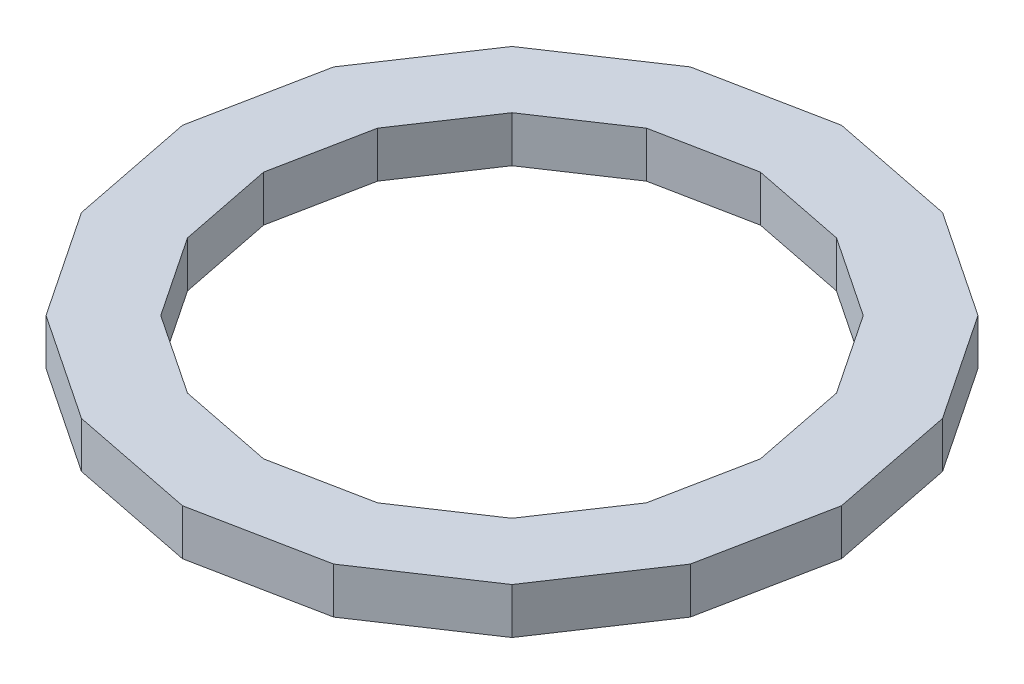
ISO-10303-21;
HEADER;
FILE_DESCRIPTION(('STEP AP214'),'2;1');
FILE_NAME('part.step','',(''),(''),'','','');
FILE_SCHEMA(('AUTOMOTIVE_DESIGN { 1 0 10303 214 1 1 1 1 }'));
ENDSEC;
DATA;
#1=APPLICATION_CONTEXT('core data for automotive mechanical design processes');
#2=APPLICATION_PROTOCOL_DEFINITION('international standard','automotive_design',2000,#1);
#3=PRODUCT_CONTEXT('',#1,'mechanical');
#4=PRODUCT('Part','Part','',(#3));
#5=PRODUCT_RELATED_PRODUCT_CATEGORY('part','',(#4));
#6=PRODUCT_DEFINITION_FORMATION('','',#4);
#7=PRODUCT_DEFINITION_CONTEXT('part definition',#1,'design');
#8=PRODUCT_DEFINITION('design','',#6,#7);
#9=PRODUCT_DEFINITION_SHAPE('','',#8);
#10=(LENGTH_UNIT() NAMED_UNIT(*) SI_UNIT(.MILLI.,.METRE.));
#11=(NAMED_UNIT(*) PLANE_ANGLE_UNIT() SI_UNIT($,.RADIAN.));
#12=(NAMED_UNIT(*) SI_UNIT($,.STERADIAN.) SOLID_ANGLE_UNIT());
#13=UNCERTAINTY_MEASURE_WITH_UNIT(LENGTH_MEASURE(1.E-05),#10,'distance_accuracy_value','');
#14=(GEOMETRIC_REPRESENTATION_CONTEXT(3) GLOBAL_UNCERTAINTY_ASSIGNED_CONTEXT((#13)) GLOBAL_UNIT_ASSIGNED_CONTEXT((#10,
#11,#12)) REPRESENTATION_CONTEXT('',''));
#15=CARTESIAN_POINT('',(0.,0.,0.));
#16=DIRECTION('',(0.,0.,1.));
#17=DIRECTION('',(1.,0.,0.));
#18=AXIS2_PLACEMENT_3D('',#15,#16,#17);
#19=CARTESIAN_POINT('',(0.,19.05,0.));
#20=DIRECTION('',(0.,1.,0.));
#21=DIRECTION('',(0.,0.,1.));
#22=AXIS2_PLACEMENT_3D('',#19,#20,#21);
#23=PLANE('',#22);
#24=DIRECTION('',(0.195090322016118,0.,-0.980785280403232));
#25=VECTOR('',#24,1.);
#26=CARTESIAN_POINT('',(126.299792206192,19.05,52.315086856707));
#27=LINE('',#26,#25);
#28=CARTESIAN_POINT('',(126.299792206192,19.05,52.315086856707));
#29=VERTEX_POINT('',#28);
#30=CARTESIAN_POINT('',(136.705909982532,19.05,-1.41921516439182E-12));
#31=VERTEX_POINT('',#30);
#32=EDGE_CURVE('E370',#29,#31,#27,.T.);
#33=ORIENTED_EDGE('',*,*,#32,.T.);
#34=DIRECTION('',(-0.195090322016138,0.,-0.980785280403228));
#35=VECTOR('',#34,1.);
#36=CARTESIAN_POINT('',(136.705909982532,19.05,-1.41921516439182E-12));
#37=LINE('',#36,#35);
#38=CARTESIAN_POINT('',(126.299792206191,19.05,-52.3150868567096));
#39=VERTEX_POINT('',#38);
#40=EDGE_CURVE('E373',#31,#39,#37,.T.);
#41=ORIENTED_EDGE('',*,*,#40,.T.);
#42=DIRECTION('',(-0.555570233019611,0.,-0.831469612302539));
#43=VECTOR('',#42,1.);
#44=CARTESIAN_POINT('',(126.299792206191,19.05,-52.3150868567096));
#45=LINE('',#44,#43);
#46=CARTESIAN_POINT('',(96.6656759769249,19.05,-96.665675976927));
#47=VERTEX_POINT('',#46);
#48=EDGE_CURVE('E376',#39,#47,#45,.T.);
#49=ORIENTED_EDGE('',*,*,#48,.T.);
#50=DIRECTION('',(-0.831469612302551,0.,-0.555570233019593));
#51=VECTOR('',#50,1.);
#52=CARTESIAN_POINT('',(96.6656759769249,19.05,-96.665675976927));
#53=LINE('',#52,#51);
#54=CARTESIAN_POINT('',(52.3150868567069,19.05,-126.299792206192));
#55=VERTEX_POINT('',#54);
#56=EDGE_CURVE('E378',#47,#55,#53,.T.);
#57=ORIENTED_EDGE('',*,*,#56,.T.);
#58=DIRECTION('',(-0.980785280403233,0.,-0.195090322016118));
#59=VECTOR('',#58,1.);
#60=CARTESIAN_POINT('',(52.3150868567069,19.05,-126.299792206192));
#61=LINE('',#60,#59);
#62=CARTESIAN_POINT('',(-1.39114260532152E-12,19.05,-136.705909982532));
#63=VERTEX_POINT('',#62);
#64=EDGE_CURVE('E380',#55,#63,#61,.T.);
#65=ORIENTED_EDGE('',*,*,#64,.T.);
#66=DIRECTION('',(-0.980785280403228,0.,0.195090322016138));
#67=VECTOR('',#66,1.);
#68=CARTESIAN_POINT('',(-1.39114260532152E-12,19.05,-136.705909982532));
#69=LINE('',#68,#67);
#70=CARTESIAN_POINT('',(-52.3150868567096,19.05,-126.299792206191));
#71=VERTEX_POINT('',#70);
#72=EDGE_CURVE('E382',#63,#71,#69,.T.);
#73=ORIENTED_EDGE('',*,*,#72,.T.);
#74=DIRECTION('',(-0.831469612302539,0.,0.555570233019611));
#75=VECTOR('',#74,1.);
#76=CARTESIAN_POINT('',(-52.3150868567096,19.05,-126.299792206191));
#77=LINE('',#76,#75);
#78=CARTESIAN_POINT('',(-96.665675976927,19.05,-96.6656759769249));
#79=VERTEX_POINT('',#78);
#80=EDGE_CURVE('E384',#71,#79,#77,.T.);
#81=ORIENTED_EDGE('',*,*,#80,.T.);
#82=DIRECTION('',(-0.555570233019594,0.,0.831469612302551));
#83=VECTOR('',#82,1.);
#84=CARTESIAN_POINT('',(-96.665675976927,19.05,-96.6656759769249));
#85=LINE('',#84,#83);
#86=CARTESIAN_POINT('',(-126.299792206192,19.05,-52.3150868567069));
#87=VERTEX_POINT('',#86);
#88=EDGE_CURVE('E386',#79,#87,#85,.T.);
#89=ORIENTED_EDGE('',*,*,#88,.T.);
#90=DIRECTION('',(-0.195090322016118,0.,0.980785280403232));
#91=VECTOR('',#90,1.);
#92=CARTESIAN_POINT('',(-126.299792206192,19.05,-52.3150868567069));
#93=LINE('',#92,#91);
#94=CARTESIAN_POINT('',(-136.705909982532,19.05,1.4953300290192E-12));
#95=VERTEX_POINT('',#94);
#96=EDGE_CURVE('E388',#87,#95,#93,.T.);
#97=ORIENTED_EDGE('',*,*,#96,.T.);
#98=DIRECTION('',(0.195090322016139,0.,0.980785280403228));
#99=VECTOR('',#98,1.);
#100=CARTESIAN_POINT('',(-136.705909982532,19.05,1.4953300290192E-12));
#101=LINE('',#100,#99);
#102=CARTESIAN_POINT('',(-126.299792206191,19.05,52.3150868567096));
#103=VERTEX_POINT('',#102);
#104=EDGE_CURVE('E390',#95,#103,#101,.T.);
#105=ORIENTED_EDGE('',*,*,#104,.T.);
#106=DIRECTION('',(0.555570233019611,0.,0.831469612302539));
#107=VECTOR('',#106,1.);
#108=CARTESIAN_POINT('',(-126.299792206191,19.05,52.3150868567096));
#109=LINE('',#108,#107);
#110=CARTESIAN_POINT('',(-96.6656759769249,19.05,96.665675976927));
#111=VERTEX_POINT('',#110);
#112=EDGE_CURVE('E392',#103,#111,#109,.T.);
#113=ORIENTED_EDGE('',*,*,#112,.T.);
#114=DIRECTION('',(0.831469612302551,0.,0.555570233019594));
#115=VECTOR('',#114,1.);
#116=CARTESIAN_POINT('',(-96.6656759769249,19.05,96.665675976927));
#117=LINE('',#116,#115);
#118=CARTESIAN_POINT('',(-52.3150868567069,19.05,126.299792206192));
#119=VERTEX_POINT('',#118);
#120=EDGE_CURVE('E394',#111,#119,#117,.T.);
#121=ORIENTED_EDGE('',*,*,#120,.T.);
#122=DIRECTION('',(0.980785280403232,0.,0.195090322016118));
#123=VECTOR('',#122,1.);
#124=CARTESIAN_POINT('',(-52.3150868567069,19.05,126.299792206192));
#125=LINE('',#124,#123);
#126=CARTESIAN_POINT('',(1.50457335673359E-12,19.05,136.705909982532));
#127=VERTEX_POINT('',#126);
#128=EDGE_CURVE('E396',#119,#127,#125,.T.);
#129=ORIENTED_EDGE('',*,*,#128,.T.);
#130=DIRECTION('',(0.980785280403228,0.,-0.195090322016138));
#131=VECTOR('',#130,1.);
#132=CARTESIAN_POINT('',(1.50457335673359E-12,19.05,136.705909982532));
#133=LINE('',#132,#131);
#134=CARTESIAN_POINT('',(52.3150868567095,19.05,126.299792206191));
#135=VERTEX_POINT('',#134);
#136=EDGE_CURVE('E398',#127,#135,#133,.T.);
#137=ORIENTED_EDGE('',*,*,#136,.T.);
#138=DIRECTION('',(0.831469612302539,0.,-0.555570233019611));
#139=VECTOR('',#138,1.);
#140=CARTESIAN_POINT('',(52.3150868567095,19.05,126.299792206191));
#141=LINE('',#140,#139);
#142=CARTESIAN_POINT('',(96.6656759769269,19.05,96.6656759769249));
#143=VERTEX_POINT('',#142);
#144=EDGE_CURVE('E400',#135,#143,#141,.T.);
#145=ORIENTED_EDGE('',*,*,#144,.T.);
#146=DIRECTION('',(0.555570233019594,0.,-0.831469612302551));
#147=VECTOR('',#146,1.);
#148=CARTESIAN_POINT('',(96.6656759769269,19.05,96.6656759769249));
#149=LINE('',#148,#147);
#150=EDGE_CURVE('E402',#143,#29,#149,.T.);
#151=ORIENTED_EDGE('',*,*,#150,.T.);
#152=EDGE_LOOP('',(#33,#41,#49,#57,#65,#73,#81,#89,#97,#105,#113,#121,#129,#137,#145,#151));
#153=FACE_BOUND('',#152,.T.);
#154=DIRECTION('',(-0.195090322016139,0.,-0.980785280403228));
#155=VECTOR('',#154,1.);
#156=CARTESIAN_POINT('',(103.039009938493,19.05,-1.14498075040855E-12));
#157=LINE('',#156,#155);
#158=CARTESIAN_POINT('',(103.039009938493,19.05,-1.14498075040855E-12));
#159=VERTEX_POINT('',#158);
#160=CARTESIAN_POINT('',(95.1956323324005,19.05,-39.4313219907642));
#161=VERTEX_POINT('',#160);
#162=EDGE_CURVE('E252',#159,#161,#157,.T.);
#163=ORIENTED_EDGE('',*,*,#162,.F.);
#164=DIRECTION('',(0.195090322016117,0.,-0.980785280403233));
#165=VECTOR('',#164,1.);
#166=CARTESIAN_POINT('',(95.1956323324013,19.05,39.4313219907621));
#167=LINE('',#166,#165);
#168=CARTESIAN_POINT('',(95.1956323324013,19.05,39.4313219907621));
#169=VERTEX_POINT('',#168);
#170=EDGE_CURVE('E244',#169,#159,#167,.T.);
#171=ORIENTED_EDGE('',*,*,#170,.F.);
#172=DIRECTION('',(0.555570233019593,0.,-0.831469612302551));
#173=VECTOR('',#172,1.);
#174=CARTESIAN_POINT('',(72.8595826542574,19.05,72.8595826542558));
#175=LINE('',#174,#173);
#176=CARTESIAN_POINT('',(72.8595826542574,19.05,72.8595826542558));
#177=VERTEX_POINT('',#176);
#178=EDGE_CURVE('E296',#177,#169,#175,.T.);
#179=ORIENTED_EDGE('',*,*,#178,.F.);
#180=DIRECTION('',(0.831469612302539,0.,-0.555570233019611));
#181=VECTOR('',#180,1.);
#182=CARTESIAN_POINT('',(39.4313219907642,19.05,95.1956323324004));
#183=LINE('',#182,#181);
#184=CARTESIAN_POINT('',(39.4313219907642,19.05,95.1956323324004));
#185=VERTEX_POINT('',#184);
#186=EDGE_CURVE('E294',#185,#177,#183,.T.);
#187=ORIENTED_EDGE('',*,*,#186,.F.);
#188=DIRECTION('',(0.980785280403228,0.,-0.195090322016139));
#189=VECTOR('',#188,1.);
#190=CARTESIAN_POINT('',(1.15672156172009E-12,19.05,103.039009938493));
#191=LINE('',#190,#189);
#192=CARTESIAN_POINT('',(1.15672156172009E-12,19.05,103.039009938493));
#193=VERTEX_POINT('',#192);
#194=EDGE_CURVE('E292',#193,#185,#191,.T.);
#195=ORIENTED_EDGE('',*,*,#194,.F.);
#196=DIRECTION('',(0.980785280403233,0.,0.195090322016118));
#197=VECTOR('',#196,1.);
#198=CARTESIAN_POINT('',(-39.4313219907621,19.05,95.1956323324013));
#199=LINE('',#198,#197);
#200=CARTESIAN_POINT('',(-39.4313219907621,19.05,95.1956323324013));
#201=VERTEX_POINT('',#200);
#202=EDGE_CURVE('E290',#201,#193,#199,.T.);
#203=ORIENTED_EDGE('',*,*,#202,.F.);
#204=DIRECTION('',(0.831469612302551,0.,0.555570233019593));
#205=VECTOR('',#204,1.);
#206=CARTESIAN_POINT('',(-72.8595826542557,19.05,72.8595826542574));
#207=LINE('',#206,#205);
#208=CARTESIAN_POINT('',(-72.8595826542557,19.05,72.8595826542574));
#209=VERTEX_POINT('',#208);
#210=EDGE_CURVE('E288',#209,#201,#207,.T.);
#211=ORIENTED_EDGE('',*,*,#210,.F.);
#212=DIRECTION('',(0.555570233019612,0.,0.831469612302539));
#213=VECTOR('',#212,1.);
#214=CARTESIAN_POINT('',(-95.1956323324004,19.05,39.4313219907642));
#215=LINE('',#214,#213);
#216=CARTESIAN_POINT('',(-95.1956323324004,19.05,39.4313219907642));
#217=VERTEX_POINT('',#216);
#218=EDGE_CURVE('E286',#217,#209,#215,.T.);
#219=ORIENTED_EDGE('',*,*,#218,.F.);
#220=DIRECTION('',(0.195090322016139,0.,0.980785280403228));
#221=VECTOR('',#220,1.);
#222=CARTESIAN_POINT('',(-103.039009938493,19.05,1.10920825365213E-12));
#223=LINE('',#222,#221);
#224=CARTESIAN_POINT('',(-103.039009938493,19.05,1.10920825365213E-12));
#225=VERTEX_POINT('',#224);
#226=EDGE_CURVE('E283',#225,#217,#223,.T.);
#227=ORIENTED_EDGE('',*,*,#226,.F.);
#228=DIRECTION('',(-0.195090322016118,0.,0.980785280403233));
#229=VECTOR('',#228,1.);
#230=CARTESIAN_POINT('',(-95.1956323324013,19.05,-39.4313219907621));
#231=LINE('',#230,#229);
#232=CARTESIAN_POINT('',(-95.1956323324013,19.05,-39.4313219907621));
#233=VERTEX_POINT('',#232);
#234=EDGE_CURVE('E281',#233,#225,#231,.T.);
#235=ORIENTED_EDGE('',*,*,#234,.F.);
#236=DIRECTION('',(-0.555570233019593,0.,0.831469612302551));
#237=VECTOR('',#236,1.);
#238=CARTESIAN_POINT('',(-72.8595826542574,19.05,-72.8595826542557));
#239=LINE('',#238,#237);
#240=CARTESIAN_POINT('',(-72.8595826542574,19.05,-72.8595826542557));
#241=VERTEX_POINT('',#240);
#242=EDGE_CURVE('E278',#241,#233,#239,.T.);
#243=ORIENTED_EDGE('',*,*,#242,.F.);
#244=DIRECTION('',(-0.831469612302539,0.,0.555570233019612));
#245=VECTOR('',#244,1.);
#246=CARTESIAN_POINT('',(-39.4313219907642,19.05,-95.1956323324004));
#247=LINE('',#246,#245);
#248=CARTESIAN_POINT('',(-39.4313219907642,19.05,-95.1956323324004));
#249=VERTEX_POINT('',#248);
#250=EDGE_CURVE('E275',#249,#241,#247,.T.);
#251=ORIENTED_EDGE('',*,*,#250,.F.);
#252=DIRECTION('',(-0.980785280403228,0.,0.195090322016139));
#253=VECTOR('',#252,1.);
#254=CARTESIAN_POINT('',(-1.10308538473897E-12,19.05,-103.039009938493));
#255=LINE('',#254,#253);
#256=CARTESIAN_POINT('',(-1.10308538473897E-12,19.05,-103.039009938493));
#257=VERTEX_POINT('',#256);
#258=EDGE_CURVE('E273',#257,#249,#255,.T.);
#259=ORIENTED_EDGE('',*,*,#258,.F.);
#260=DIRECTION('',(-0.980785280403233,0.,-0.195090322016118));
#261=VECTOR('',#260,1.);
#262=CARTESIAN_POINT('',(39.4313219907622,19.05,-95.1956323324012));
#263=LINE('',#262,#261);
#264=CARTESIAN_POINT('',(39.4313219907622,19.05,-95.1956323324012));
#265=VERTEX_POINT('',#264);
#266=EDGE_CURVE('E271',#265,#257,#263,.T.);
#267=ORIENTED_EDGE('',*,*,#266,.F.);
#268=DIRECTION('',(-0.831469612302551,0.,-0.555570233019593));
#269=VECTOR('',#268,1.);
#270=CARTESIAN_POINT('',(72.8595826542557,19.05,-72.8595826542574));
#271=LINE('',#270,#269);
#272=CARTESIAN_POINT('',(72.8595826542557,19.05,-72.8595826542574));
#273=VERTEX_POINT('',#272);
#274=EDGE_CURVE('E267',#273,#265,#271,.T.);
#275=ORIENTED_EDGE('',*,*,#274,.F.);
#276=DIRECTION('',(-0.555570233019612,0.,-0.831469612302539));
#277=VECTOR('',#276,1.);
#278=CARTESIAN_POINT('',(95.1956323324005,19.05,-39.4313219907642));
#279=LINE('',#278,#277);
#280=EDGE_CURVE('E265',#161,#273,#279,.T.);
#281=ORIENTED_EDGE('',*,*,#280,.F.);
#282=EDGE_LOOP('',(#163,#171,#179,#187,#195,#203,#211,#219,#227,#235,#243,#251,#259,#267,#275,#281));
#283=FACE_BOUND('',#282,.T.);
#284=ADVANCED_FACE('F35',(#153,#283),#23,.T.);
#285=CARTESIAN_POINT('',(0.,0.,0.));
#286=DIRECTION('',(0.,1.,0.));
#287=DIRECTION('',(0.,0.,1.));
#288=AXIS2_PLACEMENT_3D('',#285,#286,#287);
#289=PLANE('',#288);
#290=DIRECTION('',(0.195090322016118,0.,-0.980785280403232));
#291=VECTOR('',#290,1.);
#292=CARTESIAN_POINT('',(126.299792206192,0.,52.315086856707));
#293=LINE('',#292,#291);
#294=CARTESIAN_POINT('',(126.299792206192,0.,52.315086856707));
#295=VERTEX_POINT('',#294);
#296=CARTESIAN_POINT('',(136.705909982532,0.,-1.41921516439182E-12));
#297=VERTEX_POINT('',#296);
#298=EDGE_CURVE('E260',#295,#297,#293,.T.);
#299=ORIENTED_EDGE('',*,*,#298,.F.);
#300=DIRECTION('',(0.555570233019594,0.,-0.831469612302551));
#301=VECTOR('',#300,1.);
#302=CARTESIAN_POINT('',(96.6656759769269,0.,96.6656759769249));
#303=LINE('',#302,#301);
#304=CARTESIAN_POINT('',(96.6656759769269,0.,96.6656759769249));
#305=VERTEX_POINT('',#304);
#306=EDGE_CURVE('E374',#305,#295,#303,.T.);
#307=ORIENTED_EDGE('',*,*,#306,.F.);
#308=DIRECTION('',(0.831469612302539,0.,-0.555570233019611));
#309=VECTOR('',#308,1.);
#310=CARTESIAN_POINT('',(52.3150868567095,0.,126.299792206191));
#311=LINE('',#310,#309);
#312=CARTESIAN_POINT('',(52.3150868567095,0.,126.299792206191));
#313=VERTEX_POINT('',#312);
#314=EDGE_CURVE('E437',#313,#305,#311,.T.);
#315=ORIENTED_EDGE('',*,*,#314,.F.);
#316=DIRECTION('',(0.980785280403228,0.,-0.195090322016138));
#317=VECTOR('',#316,1.);
#318=CARTESIAN_POINT('',(1.50457335673359E-12,0.,136.705909982532));
#319=LINE('',#318,#317);
#320=CARTESIAN_POINT('',(1.50457335673359E-12,0.,136.705909982532));
#321=VERTEX_POINT('',#320);
#322=EDGE_CURVE('E434',#321,#313,#319,.T.);
#323=ORIENTED_EDGE('',*,*,#322,.F.);
#324=DIRECTION('',(0.980785280403232,0.,0.195090322016118));
#325=VECTOR('',#324,1.);
#326=CARTESIAN_POINT('',(-52.3150868567069,0.,126.299792206192));
#327=LINE('',#326,#325);
#328=CARTESIAN_POINT('',(-52.3150868567069,0.,126.299792206192));
#329=VERTEX_POINT('',#328);
#330=EDGE_CURVE('E432',#329,#321,#327,.T.);
#331=ORIENTED_EDGE('',*,*,#330,.F.);
#332=DIRECTION('',(0.831469612302551,0.,0.555570233019594));
#333=VECTOR('',#332,1.);
#334=CARTESIAN_POINT('',(-96.6656759769249,0.,96.665675976927));
#335=LINE('',#334,#333);
#336=CARTESIAN_POINT('',(-96.6656759769249,0.,96.665675976927));
#337=VERTEX_POINT('',#336);
#338=EDGE_CURVE('E430',#337,#329,#335,.T.);
#339=ORIENTED_EDGE('',*,*,#338,.F.);
#340=DIRECTION('',(0.555570233019611,0.,0.831469612302539));
#341=VECTOR('',#340,1.);
#342=CARTESIAN_POINT('',(-126.299792206191,0.,52.3150868567096));
#343=LINE('',#342,#341);
#344=CARTESIAN_POINT('',(-126.299792206191,0.,52.3150868567096));
#345=VERTEX_POINT('',#344);
#346=EDGE_CURVE('E428',#345,#337,#343,.T.);
#347=ORIENTED_EDGE('',*,*,#346,.F.);
#348=DIRECTION('',(0.195090322016139,0.,0.980785280403228));
#349=VECTOR('',#348,1.);
#350=CARTESIAN_POINT('',(-136.705909982532,0.,1.4953300290192E-12));
#351=LINE('',#350,#349);
#352=CARTESIAN_POINT('',(-136.705909982532,0.,1.4953300290192E-12));
#353=VERTEX_POINT('',#352);
#354=EDGE_CURVE('E426',#353,#345,#351,.T.);
#355=ORIENTED_EDGE('',*,*,#354,.F.);
#356=DIRECTION('',(-0.195090322016118,0.,0.980785280403232));
#357=VECTOR('',#356,1.);
#358=CARTESIAN_POINT('',(-126.299792206192,0.,-52.3150868567069));
#359=LINE('',#358,#357);
#360=CARTESIAN_POINT('',(-126.299792206192,0.,-52.3150868567069));
#361=VERTEX_POINT('',#360);
#362=EDGE_CURVE('E423',#361,#353,#359,.T.);
#363=ORIENTED_EDGE('',*,*,#362,.F.);
#364=DIRECTION('',(-0.555570233019594,0.,0.831469612302551));
#365=VECTOR('',#364,1.);
#366=CARTESIAN_POINT('',(-96.665675976927,0.,-96.6656759769249));
#367=LINE('',#366,#365);
#368=CARTESIAN_POINT('',(-96.665675976927,0.,-96.6656759769249));
#369=VERTEX_POINT('',#368);
#370=EDGE_CURVE('E421',#369,#361,#367,.T.);
#371=ORIENTED_EDGE('',*,*,#370,.F.);
#372=DIRECTION('',(-0.831469612302539,0.,0.555570233019611));
#373=VECTOR('',#372,1.);
#374=CARTESIAN_POINT('',(-52.3150868567096,0.,-126.299792206191));
#375=LINE('',#374,#373);
#376=CARTESIAN_POINT('',(-52.3150868567096,0.,-126.299792206191));
#377=VERTEX_POINT('',#376);
#378=EDGE_CURVE('E419',#377,#369,#375,.T.);
#379=ORIENTED_EDGE('',*,*,#378,.F.);
#380=DIRECTION('',(-0.980785280403228,0.,0.195090322016138));
#381=VECTOR('',#380,1.);
#382=CARTESIAN_POINT('',(-1.39114260532152E-12,0.,-136.705909982532));
#383=LINE('',#382,#381);
#384=CARTESIAN_POINT('',(-1.39114260532152E-12,0.,-136.705909982532));
#385=VERTEX_POINT('',#384);
#386=EDGE_CURVE('E417',#385,#377,#383,.T.);
#387=ORIENTED_EDGE('',*,*,#386,.F.);
#388=DIRECTION('',(-0.980785280403233,0.,-0.195090322016118));
#389=VECTOR('',#388,1.);
#390=CARTESIAN_POINT('',(52.3150868567069,0.,-126.299792206192));
#391=LINE('',#390,#389);
#392=CARTESIAN_POINT('',(52.3150868567069,0.,-126.299792206192));
#393=VERTEX_POINT('',#392);
#394=EDGE_CURVE('E415',#393,#385,#391,.T.);
#395=ORIENTED_EDGE('',*,*,#394,.F.);
#396=DIRECTION('',(-0.831469612302551,0.,-0.555570233019593));
#397=VECTOR('',#396,1.);
#398=CARTESIAN_POINT('',(96.6656759769249,0.,-96.665675976927));
#399=LINE('',#398,#397);
#400=CARTESIAN_POINT('',(96.6656759769249,0.,-96.665675976927));
#401=VERTEX_POINT('',#400);
#402=EDGE_CURVE('E412',#401,#393,#399,.T.);
#403=ORIENTED_EDGE('',*,*,#402,.F.);
#404=DIRECTION('',(-0.555570233019611,0.,-0.831469612302539));
#405=VECTOR('',#404,1.);
#406=CARTESIAN_POINT('',(126.299792206191,0.,-52.3150868567096));
#407=LINE('',#406,#405);
#408=CARTESIAN_POINT('',(126.299792206191,0.,-52.3150868567096));
#409=VERTEX_POINT('',#408);
#410=EDGE_CURVE('E409',#409,#401,#407,.T.);
#411=ORIENTED_EDGE('',*,*,#410,.F.);
#412=DIRECTION('',(-0.195090322016138,0.,-0.980785280403228));
#413=VECTOR('',#412,1.);
#414=CARTESIAN_POINT('',(136.705909982532,0.,-1.41921516439182E-12));
#415=LINE('',#414,#413);
#416=EDGE_CURVE('E407',#297,#409,#415,.T.);
#417=ORIENTED_EDGE('',*,*,#416,.F.);
#418=EDGE_LOOP('',(#299,#307,#315,#323,#331,#339,#347,#355,#363,#371,#379,#387,#395,#403,#411,#417));
#419=FACE_BOUND('',#418,.T.);
#420=DIRECTION('',(0.195090322016117,0.,-0.980785280403233));
#421=VECTOR('',#420,1.);
#422=CARTESIAN_POINT('',(95.1956323324013,0.,39.4313219907621));
#423=LINE('',#422,#421);
#424=CARTESIAN_POINT('',(95.1956323324013,0.,39.4313219907621));
#425=VERTEX_POINT('',#424);
#426=CARTESIAN_POINT('',(103.039009938493,0.,-1.14498075040855E-12));
#427=VERTEX_POINT('',#426);
#428=EDGE_CURVE('E58',#425,#427,#423,.T.);
#429=ORIENTED_EDGE('',*,*,#428,.T.);
#430=DIRECTION('',(-0.195090322016139,0.,-0.980785280403228));
#431=VECTOR('',#430,1.);
#432=CARTESIAN_POINT('',(103.039009938493,0.,-1.14498075040855E-12));
#433=LINE('',#432,#431);
#434=CARTESIAN_POINT('',(95.1956323324005,0.,-39.4313219907642));
#435=VERTEX_POINT('',#434);
#436=EDGE_CURVE('E259',#427,#435,#433,.T.);
#437=ORIENTED_EDGE('',*,*,#436,.T.);
#438=DIRECTION('',(-0.555570233019612,0.,-0.831469612302539));
#439=VECTOR('',#438,1.);
#440=CARTESIAN_POINT('',(95.1956323324005,0.,-39.4313219907642));
#441=LINE('',#440,#439);
#442=CARTESIAN_POINT('',(72.8595826542557,0.,-72.8595826542574));
#443=VERTEX_POINT('',#442);
#444=EDGE_CURVE('E300',#435,#443,#441,.T.);
#445=ORIENTED_EDGE('',*,*,#444,.T.);
#446=DIRECTION('',(-0.831469612302551,0.,-0.555570233019593));
#447=VECTOR('',#446,1.);
#448=CARTESIAN_POINT('',(72.8595826542557,0.,-72.8595826542574));
#449=LINE('',#448,#447);
#450=CARTESIAN_POINT('',(39.4313219907622,0.,-95.1956323324012));
#451=VERTEX_POINT('',#450);
#452=EDGE_CURVE('E303',#443,#451,#449,.T.);
#453=ORIENTED_EDGE('',*,*,#452,.T.);
#454=DIRECTION('',(-0.980785280403233,0.,-0.195090322016118));
#455=VECTOR('',#454,1.);
#456=CARTESIAN_POINT('',(39.4313219907622,0.,-95.1956323324012));
#457=LINE('',#456,#455);
#458=CARTESIAN_POINT('',(-1.10308538473897E-12,0.,-103.039009938493));
#459=VERTEX_POINT('',#458);
#460=EDGE_CURVE('E307',#451,#459,#457,.T.);
#461=ORIENTED_EDGE('',*,*,#460,.T.);
#462=DIRECTION('',(-0.980785280403228,0.,0.195090322016139));
#463=VECTOR('',#462,1.);
#464=CARTESIAN_POINT('',(-1.10308538473897E-12,0.,-103.039009938493));
#465=LINE('',#464,#463);
#466=CARTESIAN_POINT('',(-39.4313219907642,0.,-95.1956323324004));
#467=VERTEX_POINT('',#466);
#468=EDGE_CURVE('E310',#459,#467,#465,.T.);
#469=ORIENTED_EDGE('',*,*,#468,.T.);
#470=DIRECTION('',(-0.831469612302539,0.,0.555570233019612));
#471=VECTOR('',#470,1.);
#472=CARTESIAN_POINT('',(-39.4313219907642,0.,-95.1956323324004));
#473=LINE('',#472,#471);
#474=CARTESIAN_POINT('',(-72.8595826542574,0.,-72.8595826542557));
#475=VERTEX_POINT('',#474);
#476=EDGE_CURVE('E313',#467,#475,#473,.T.);
#477=ORIENTED_EDGE('',*,*,#476,.T.);
#478=DIRECTION('',(-0.555570233019593,0.,0.831469612302551));
#479=VECTOR('',#478,1.);
#480=CARTESIAN_POINT('',(-72.8595826542574,0.,-72.8595826542557));
#481=LINE('',#480,#479);
#482=CARTESIAN_POINT('',(-95.1956323324013,0.,-39.4313219907621));
#483=VERTEX_POINT('',#482);
#484=EDGE_CURVE('E316',#475,#483,#481,.T.);
#485=ORIENTED_EDGE('',*,*,#484,.T.);
#486=DIRECTION('',(-0.195090322016118,0.,0.980785280403233));
#487=VECTOR('',#486,1.);
#488=CARTESIAN_POINT('',(-95.1956323324013,0.,-39.4313219907621));
#489=LINE('',#488,#487);
#490=CARTESIAN_POINT('',(-103.039009938493,0.,1.10920825365213E-12));
#491=VERTEX_POINT('',#490);
#492=EDGE_CURVE('E319',#483,#491,#489,.T.);
#493=ORIENTED_EDGE('',*,*,#492,.T.);
#494=DIRECTION('',(0.195090322016139,0.,0.980785280403228));
#495=VECTOR('',#494,1.);
#496=CARTESIAN_POINT('',(-103.039009938493,0.,1.10920825365213E-12));
#497=LINE('',#496,#495);
#498=CARTESIAN_POINT('',(-95.1956323324004,0.,39.4313219907642));
#499=VERTEX_POINT('',#498);
#500=EDGE_CURVE('E322',#491,#499,#497,.T.);
#501=ORIENTED_EDGE('',*,*,#500,.T.);
#502=DIRECTION('',(0.555570233019612,0.,0.831469612302539));
#503=VECTOR('',#502,1.);
#504=CARTESIAN_POINT('',(-95.1956323324004,0.,39.4313219907642));
#505=LINE('',#504,#503);
#506=CARTESIAN_POINT('',(-72.8595826542557,0.,72.8595826542574));
#507=VERTEX_POINT('',#506);
#508=EDGE_CURVE('E325',#499,#507,#505,.T.);
#509=ORIENTED_EDGE('',*,*,#508,.T.);
#510=DIRECTION('',(0.831469612302551,0.,0.555570233019593));
#511=VECTOR('',#510,1.);
#512=CARTESIAN_POINT('',(-72.8595826542557,0.,72.8595826542574));
#513=LINE('',#512,#511);
#514=CARTESIAN_POINT('',(-39.4313219907621,0.,95.1956323324013));
#515=VERTEX_POINT('',#514);
#516=EDGE_CURVE('E328',#507,#515,#513,.T.);
#517=ORIENTED_EDGE('',*,*,#516,.T.);
#518=DIRECTION('',(0.980785280403233,0.,0.195090322016118));
#519=VECTOR('',#518,1.);
#520=CARTESIAN_POINT('',(-39.4313219907621,0.,95.1956323324013));
#521=LINE('',#520,#519);
#522=CARTESIAN_POINT('',(1.15672156172009E-12,0.,103.039009938493));
#523=VERTEX_POINT('',#522);
#524=EDGE_CURVE('E331',#515,#523,#521,.T.);
#525=ORIENTED_EDGE('',*,*,#524,.T.);
#526=DIRECTION('',(0.980785280403228,0.,-0.195090322016139));
#527=VECTOR('',#526,1.);
#528=CARTESIAN_POINT('',(1.15672156172009E-12,0.,103.039009938493));
#529=LINE('',#528,#527);
#530=CARTESIAN_POINT('',(39.4313219907642,0.,95.1956323324004));
#531=VERTEX_POINT('',#530);
#532=EDGE_CURVE('E335',#523,#531,#529,.T.);
#533=ORIENTED_EDGE('',*,*,#532,.T.);
#534=DIRECTION('',(0.831469612302539,0.,-0.555570233019611));
#535=VECTOR('',#534,1.);
#536=CARTESIAN_POINT('',(39.4313219907642,0.,95.1956323324004));
#537=LINE('',#536,#535);
#538=CARTESIAN_POINT('',(72.8595826542574,0.,72.8595826542558));
#539=VERTEX_POINT('',#538);
#540=EDGE_CURVE('E338',#531,#539,#537,.T.);
#541=ORIENTED_EDGE('',*,*,#540,.T.);
#542=DIRECTION('',(0.555570233019593,0.,-0.831469612302551));
#543=VECTOR('',#542,1.);
#544=CARTESIAN_POINT('',(72.8595826542574,0.,72.8595826542558));
#545=LINE('',#544,#543);
#546=EDGE_CURVE('E253',#539,#425,#545,.T.);
#547=ORIENTED_EDGE('',*,*,#546,.T.);
#548=EDGE_LOOP('',(#429,#437,#445,#453,#461,#469,#477,#485,#493,#501,#509,#517,#525,#533,#541,#547));
#549=FACE_BOUND('',#548,.T.);
#550=ADVANCED_FACE('F497',(#419,#549),#289,.F.);
#551=CARTESIAN_POINT('',(126.299792206192,19.05,52.315086856707));
#552=DIRECTION('',(-0.980785280403232,0.,-0.195090322016118));
#553=DIRECTION('',(-0.195090322016118,0.,0.980785280403233));
#554=AXIS2_PLACEMENT_3D('',#551,#552,#553);
#555=PLANE('',#554);
#556=ORIENTED_EDGE('',*,*,#298,.T.);
#557=DIRECTION('',(0.,-1.,0.));
#558=VECTOR('',#557,1.);
#559=CARTESIAN_POINT('',(136.705909982532,19.05,-1.41921516439182E-12));
#560=LINE('',#559,#558);
#561=EDGE_CURVE('E11',#31,#297,#560,.T.);
#562=ORIENTED_EDGE('',*,*,#561,.F.);
#563=ORIENTED_EDGE('',*,*,#32,.F.);
#564=DIRECTION('',(0.,-1.,0.));
#565=VECTOR('',#564,1.);
#566=CARTESIAN_POINT('',(126.299792206192,19.05,52.315086856707));
#567=LINE('',#566,#565);
#568=EDGE_CURVE('E404',#29,#295,#567,.T.);
#569=ORIENTED_EDGE('',*,*,#568,.T.);
#570=EDGE_LOOP('',(#556,#562,#563,#569));
#571=FACE_BOUND('',#570,.T.);
#572=ADVANCED_FACE('F37',(#571),#555,.F.);
#573=CARTESIAN_POINT('',(136.705909982532,19.05,-1.41921516439182E-12));
#574=DIRECTION('',(-0.980785280403228,0.,0.195090322016138));
#575=DIRECTION('',(0.195090322016138,0.,0.980785280403229));
#576=AXIS2_PLACEMENT_3D('',#573,#574,#575);
#577=PLANE('',#576);
#578=ORIENTED_EDGE('',*,*,#416,.T.);
#579=DIRECTION('',(0.,-1.,0.));
#580=VECTOR('',#579,1.);
#581=CARTESIAN_POINT('',(126.299792206191,19.05,-52.3150868567096));
#582=LINE('',#581,#580);
#583=EDGE_CURVE('E43',#39,#409,#582,.T.);
#584=ORIENTED_EDGE('',*,*,#583,.F.);
#585=ORIENTED_EDGE('',*,*,#40,.F.);
#586=ORIENTED_EDGE('',*,*,#561,.T.);
#587=EDGE_LOOP('',(#578,#584,#585,#586));
#588=FACE_BOUND('',#587,.T.);
#589=ADVANCED_FACE('F514',(#588),#577,.F.);
#590=CARTESIAN_POINT('',(126.299792206191,19.05,-52.3150868567096));
#591=DIRECTION('',(-0.831469612302539,0.,0.555570233019611));
#592=DIRECTION('',(0.555570233019611,0.,0.831469612302539));
#593=AXIS2_PLACEMENT_3D('',#590,#591,#592);
#594=PLANE('',#593);
#595=ORIENTED_EDGE('',*,*,#410,.T.);
#596=DIRECTION('',(0.,-1.,0.));
#597=VECTOR('',#596,1.);
#598=CARTESIAN_POINT('',(96.6656759769249,19.05,-96.665675976927));
#599=LINE('',#598,#597);
#600=EDGE_CURVE('E484',#47,#401,#599,.T.);
#601=ORIENTED_EDGE('',*,*,#600,.F.);
#602=ORIENTED_EDGE('',*,*,#48,.F.);
#603=ORIENTED_EDGE('',*,*,#583,.T.);
#604=EDGE_LOOP('',(#595,#601,#602,#603));
#605=FACE_BOUND('',#604,.T.);
#606=ADVANCED_FACE('F491',(#605),#594,.F.);
#607=CARTESIAN_POINT('',(96.6656759769249,19.05,-96.665675976927));
#608=DIRECTION('',(-0.555570233019593,0.,0.831469612302551));
#609=DIRECTION('',(0.831469612302551,0.,0.555570233019593));
#610=AXIS2_PLACEMENT_3D('',#607,#608,#609);
#611=PLANE('',#610);
#612=ORIENTED_EDGE('',*,*,#402,.T.);
#613=DIRECTION('',(0.,-1.,0.));
#614=VECTOR('',#613,1.);
#615=CARTESIAN_POINT('',(52.3150868567069,19.05,-126.299792206192));
#616=LINE('',#615,#614);
#617=EDGE_CURVE('E481',#55,#393,#616,.T.);
#618=ORIENTED_EDGE('',*,*,#617,.F.);
#619=ORIENTED_EDGE('',*,*,#56,.F.);
#620=ORIENTED_EDGE('',*,*,#600,.T.);
#621=EDGE_LOOP('',(#612,#618,#619,#620));
#622=FACE_BOUND('',#621,.T.);
#623=ADVANCED_FACE('F503',(#622),#611,.F.);
#624=CARTESIAN_POINT('',(52.3150868567069,19.05,-126.299792206192));
#625=DIRECTION('',(-0.195090322016118,0.,0.980785280403233));
#626=DIRECTION('',(0.980785280403233,0.,0.195090322016118));
#627=AXIS2_PLACEMENT_3D('',#624,#625,#626);
#628=PLANE('',#627);
#629=ORIENTED_EDGE('',*,*,#394,.T.);
#630=DIRECTION('',(0.,-1.,0.));
#631=VECTOR('',#630,1.);
#632=CARTESIAN_POINT('',(-1.39114260532152E-12,19.05,-136.705909982532));
#633=LINE('',#632,#631);
#634=EDGE_CURVE('E478',#63,#385,#633,.T.);
#635=ORIENTED_EDGE('',*,*,#634,.F.);
#636=ORIENTED_EDGE('',*,*,#64,.F.);
#637=ORIENTED_EDGE('',*,*,#617,.T.);
#638=EDGE_LOOP('',(#629,#635,#636,#637));
#639=FACE_BOUND('',#638,.T.);
#640=ADVANCED_FACE('F507',(#639),#628,.F.);
#641=CARTESIAN_POINT('',(-1.39114260532152E-12,19.05,-136.705909982532));
#642=DIRECTION('',(0.195090322016138,0.,0.980785280403228));
#643=DIRECTION('',(0.980785280403229,0.,-0.195090322016138));
#644=AXIS2_PLACEMENT_3D('',#641,#642,#643);
#645=PLANE('',#644);
#646=ORIENTED_EDGE('',*,*,#386,.T.);
#647=DIRECTION('',(0.,-1.,0.));
#648=VECTOR('',#647,1.);
#649=CARTESIAN_POINT('',(-52.3150868567096,19.05,-126.299792206191));
#650=LINE('',#649,#648);
#651=EDGE_CURVE('E475',#71,#377,#650,.T.);
#652=ORIENTED_EDGE('',*,*,#651,.F.);
#653=ORIENTED_EDGE('',*,*,#72,.F.);
#654=ORIENTED_EDGE('',*,*,#634,.T.);
#655=EDGE_LOOP('',(#646,#652,#653,#654));
#656=FACE_BOUND('',#655,.T.);
#657=ADVANCED_FACE('F567',(#656),#645,.F.);
#658=CARTESIAN_POINT('',(-52.3150868567096,19.05,-126.299792206191));
#659=DIRECTION('',(0.555570233019611,0.,0.831469612302539));
#660=DIRECTION('',(0.831469612302539,0.,-0.555570233019611));
#661=AXIS2_PLACEMENT_3D('',#658,#659,#660);
#662=PLANE('',#661);
#663=ORIENTED_EDGE('',*,*,#378,.T.);
#664=DIRECTION('',(0.,-1.,0.));
#665=VECTOR('',#664,1.);
#666=CARTESIAN_POINT('',(-96.665675976927,19.05,-96.6656759769249));
#667=LINE('',#666,#665);
#668=EDGE_CURVE('E472',#79,#369,#667,.T.);
#669=ORIENTED_EDGE('',*,*,#668,.F.);
#670=ORIENTED_EDGE('',*,*,#80,.F.);
#671=ORIENTED_EDGE('',*,*,#651,.T.);
#672=EDGE_LOOP('',(#663,#669,#670,#671));
#673=FACE_BOUND('',#672,.T.);
#674=ADVANCED_FACE('F564',(#673),#662,.F.);
#675=CARTESIAN_POINT('',(-96.665675976927,19.05,-96.6656759769249));
#676=DIRECTION('',(0.831469612302551,0.,0.555570233019594));
#677=DIRECTION('',(0.555570233019594,0.,-0.831469612302551));
#678=AXIS2_PLACEMENT_3D('',#675,#676,#677);
#679=PLANE('',#678);
#680=ORIENTED_EDGE('',*,*,#370,.T.);
#681=DIRECTION('',(0.,-1.,0.));
#682=VECTOR('',#681,1.);
#683=CARTESIAN_POINT('',(-126.299792206192,19.05,-52.3150868567069));
#684=LINE('',#683,#682);
#685=EDGE_CURVE('E468',#87,#361,#684,.T.);
#686=ORIENTED_EDGE('',*,*,#685,.F.);
#687=ORIENTED_EDGE('',*,*,#88,.F.);
#688=ORIENTED_EDGE('',*,*,#668,.T.);
#689=EDGE_LOOP('',(#680,#686,#687,#688));
#690=FACE_BOUND('',#689,.T.);
#691=ADVANCED_FACE('F560',(#690),#679,.F.);
#692=CARTESIAN_POINT('',(-126.299792206192,19.05,-52.3150868567069));
#693=DIRECTION('',(0.980785280403232,0.,0.195090322016118));
#694=DIRECTION('',(0.195090322016118,0.,-0.980785280403233));
#695=AXIS2_PLACEMENT_3D('',#692,#693,#694);
#696=PLANE('',#695);
#697=ORIENTED_EDGE('',*,*,#362,.T.);
#698=DIRECTION('',(0.,-1.,0.));
#699=VECTOR('',#698,1.);
#700=CARTESIAN_POINT('',(-136.705909982532,19.05,1.4953300290192E-12));
#701=LINE('',#700,#699);
#702=EDGE_CURVE('E465',#95,#353,#701,.T.);
#703=ORIENTED_EDGE('',*,*,#702,.F.);
#704=ORIENTED_EDGE('',*,*,#96,.F.);
#705=ORIENTED_EDGE('',*,*,#685,.T.);
#706=EDGE_LOOP('',(#697,#703,#704,#705));
#707=FACE_BOUND('',#706,.T.);
#708=ADVANCED_FACE('F556',(#707),#696,.F.);
#709=CARTESIAN_POINT('',(-136.705909982532,19.05,1.4953300290192E-12));
#710=DIRECTION('',(0.980785280403228,0.,-0.195090322016139));
#711=DIRECTION('',(-0.195090322016139,0.,-0.980785280403229));
#712=AXIS2_PLACEMENT_3D('',#709,#710,#711);
#713=PLANE('',#712);
#714=ORIENTED_EDGE('',*,*,#354,.T.);
#715=DIRECTION('',(0.,-1.,0.));
#716=VECTOR('',#715,1.);
#717=CARTESIAN_POINT('',(-126.299792206191,19.05,52.3150868567096));
#718=LINE('',#717,#716);
#719=EDGE_CURVE('E461',#103,#345,#718,.T.);
#720=ORIENTED_EDGE('',*,*,#719,.F.);
#721=ORIENTED_EDGE('',*,*,#104,.F.);
#722=ORIENTED_EDGE('',*,*,#702,.T.);
#723=EDGE_LOOP('',(#714,#720,#721,#722));
#724=FACE_BOUND('',#723,.T.);
#725=ADVANCED_FACE('F551',(#724),#713,.F.);
#726=CARTESIAN_POINT('',(-126.299792206191,19.05,52.3150868567096));
#727=DIRECTION('',(0.831469612302539,0.,-0.555570233019611));
#728=DIRECTION('',(-0.555570233019611,0.,-0.831469612302539));
#729=AXIS2_PLACEMENT_3D('',#726,#727,#728);
#730=PLANE('',#729);
#731=ORIENTED_EDGE('',*,*,#346,.T.);
#732=DIRECTION('',(0.,-1.,0.));
#733=VECTOR('',#732,1.);
#734=CARTESIAN_POINT('',(-96.6656759769249,19.05,96.665675976927));
#735=LINE('',#734,#733);
#736=EDGE_CURVE('E458',#111,#337,#735,.T.);
#737=ORIENTED_EDGE('',*,*,#736,.F.);
#738=ORIENTED_EDGE('',*,*,#112,.F.);
#739=ORIENTED_EDGE('',*,*,#719,.T.);
#740=EDGE_LOOP('',(#731,#737,#738,#739));
#741=FACE_BOUND('',#740,.T.);
#742=ADVANCED_FACE('F545',(#741),#730,.F.);
#743=CARTESIAN_POINT('',(-96.6656759769249,19.05,96.665675976927));
#744=DIRECTION('',(0.555570233019594,0.,-0.831469612302551));
#745=DIRECTION('',(-0.831469612302551,0.,-0.555570233019594));
#746=AXIS2_PLACEMENT_3D('',#743,#744,#745);
#747=PLANE('',#746);
#748=ORIENTED_EDGE('',*,*,#338,.T.);
#749=DIRECTION('',(0.,-1.,0.));
#750=VECTOR('',#749,1.);
#751=CARTESIAN_POINT('',(-52.3150868567069,19.05,126.299792206192));
#752=LINE('',#751,#750);
#753=EDGE_CURVE('E454',#119,#329,#752,.T.);
#754=ORIENTED_EDGE('',*,*,#753,.F.);
#755=ORIENTED_EDGE('',*,*,#120,.F.);
#756=ORIENTED_EDGE('',*,*,#736,.T.);
#757=EDGE_LOOP('',(#748,#754,#755,#756));
#758=FACE_BOUND('',#757,.T.);
#759=ADVANCED_FACE('F541',(#758),#747,.F.);
#760=CARTESIAN_POINT('',(-52.3150868567069,19.05,126.299792206192));
#761=DIRECTION('',(0.195090322016118,0.,-0.980785280403233));
#762=DIRECTION('',(-0.980785280403233,0.,-0.195090322016118));
#763=AXIS2_PLACEMENT_3D('',#760,#761,#762);
#764=PLANE('',#763);
#765=ORIENTED_EDGE('',*,*,#330,.T.);
#766=DIRECTION('',(0.,-1.,0.));
#767=VECTOR('',#766,1.);
#768=CARTESIAN_POINT('',(1.50457335673359E-12,19.05,136.705909982532));
#769=LINE('',#768,#767);
#770=EDGE_CURVE('E450',#127,#321,#769,.T.);
#771=ORIENTED_EDGE('',*,*,#770,.F.);
#772=ORIENTED_EDGE('',*,*,#128,.F.);
#773=ORIENTED_EDGE('',*,*,#753,.T.);
#774=EDGE_LOOP('',(#765,#771,#772,#773));
#775=FACE_BOUND('',#774,.T.);
#776=ADVANCED_FACE('F536',(#775),#764,.F.);
#777=CARTESIAN_POINT('',(1.50457335673359E-12,19.05,136.705909982532));
#778=DIRECTION('',(-0.195090322016138,0.,-0.980785280403229));
#779=DIRECTION('',(-0.980785280403229,0.,0.195090322016138));
#780=AXIS2_PLACEMENT_3D('',#777,#778,#779);
#781=PLANE('',#780);
#782=ORIENTED_EDGE('',*,*,#322,.T.);
#783=DIRECTION('',(0.,-1.,0.));
#784=VECTOR('',#783,1.);
#785=CARTESIAN_POINT('',(52.3150868567095,19.05,126.299792206191));
#786=LINE('',#785,#784);
#787=EDGE_CURVE('E446',#135,#313,#786,.T.);
#788=ORIENTED_EDGE('',*,*,#787,.F.);
#789=ORIENTED_EDGE('',*,*,#136,.F.);
#790=ORIENTED_EDGE('',*,*,#770,.T.);
#791=EDGE_LOOP('',(#782,#788,#789,#790));
#792=FACE_BOUND('',#791,.T.);
#793=ADVANCED_FACE('F530',(#792),#781,.F.);
#794=CARTESIAN_POINT('',(52.3150868567095,19.05,126.299792206191));
#795=DIRECTION('',(-0.555570233019611,0.,-0.831469612302539));
#796=DIRECTION('',(-0.831469612302539,0.,0.555570233019611));
#797=AXIS2_PLACEMENT_3D('',#794,#795,#796);
#798=PLANE('',#797);
#799=ORIENTED_EDGE('',*,*,#314,.T.);
#800=DIRECTION('',(0.,-1.,0.));
#801=VECTOR('',#800,1.);
#802=CARTESIAN_POINT('',(96.6656759769269,19.05,96.6656759769249));
#803=LINE('',#802,#801);
#804=EDGE_CURVE('E443',#143,#305,#803,.T.);
#805=ORIENTED_EDGE('',*,*,#804,.F.);
#806=ORIENTED_EDGE('',*,*,#144,.F.);
#807=ORIENTED_EDGE('',*,*,#787,.T.);
#808=EDGE_LOOP('',(#799,#805,#806,#807));
#809=FACE_BOUND('',#808,.T.);
#810=ADVANCED_FACE('F526',(#809),#798,.F.);
#811=CARTESIAN_POINT('',(96.6656759769269,19.05,96.6656759769249));
#812=DIRECTION('',(-0.831469612302551,0.,-0.555570233019594));
#813=DIRECTION('',(-0.555570233019594,0.,0.831469612302551));
#814=AXIS2_PLACEMENT_3D('',#811,#812,#813);
#815=PLANE('',#814);
#816=ORIENTED_EDGE('',*,*,#306,.T.);
#817=ORIENTED_EDGE('',*,*,#568,.F.);
#818=ORIENTED_EDGE('',*,*,#150,.F.);
#819=ORIENTED_EDGE('',*,*,#804,.T.);
#820=EDGE_LOOP('',(#816,#817,#818,#819));
#821=FACE_BOUND('',#820,.T.);
#822=ADVANCED_FACE('F521',(#821),#815,.F.);
#823=CARTESIAN_POINT('',(95.1956323324013,19.05,39.4313219907621));
#824=DIRECTION('',(-0.980785280403233,0.,-0.195090322016117));
#825=DIRECTION('',(-0.195090322016118,0.,0.980785280403233));
#826=AXIS2_PLACEMENT_3D('',#823,#824,#825);
#827=PLANE('',#826);
#828=ORIENTED_EDGE('',*,*,#428,.F.);
#829=DIRECTION('',(0.,-1.,0.));
#830=VECTOR('',#829,1.);
#831=CARTESIAN_POINT('',(95.1956323324013,19.05,39.4313219907621));
#832=LINE('',#831,#830);
#833=EDGE_CURVE('E248',#169,#425,#832,.T.);
#834=ORIENTED_EDGE('',*,*,#833,.F.);
#835=ORIENTED_EDGE('',*,*,#170,.T.);
#836=DIRECTION('',(0.,-1.,0.));
#837=VECTOR('',#836,1.);
#838=CARTESIAN_POINT('',(103.039009938493,19.05,-1.14498075040855E-12));
#839=LINE('',#838,#837);
#840=EDGE_CURVE('E247',#159,#427,#839,.T.);
#841=ORIENTED_EDGE('',*,*,#840,.T.);
#842=EDGE_LOOP('',(#828,#834,#835,#841));
#843=FACE_BOUND('',#842,.T.);
#844=ADVANCED_FACE('F246',(#843),#827,.T.);
#845=CARTESIAN_POINT('',(103.039009938493,19.05,-1.14498075040855E-12));
#846=DIRECTION('',(-0.980785280403228,0.,0.195090322016139));
#847=DIRECTION('',(0.195090322016139,0.,0.980785280403228));
#848=AXIS2_PLACEMENT_3D('',#845,#846,#847);
#849=PLANE('',#848);
#850=ORIENTED_EDGE('',*,*,#436,.F.);
#851=ORIENTED_EDGE('',*,*,#840,.F.);
#852=ORIENTED_EDGE('',*,*,#162,.T.);
#853=DIRECTION('',(0.,-1.,0.));
#854=VECTOR('',#853,1.);
#855=CARTESIAN_POINT('',(95.1956323324005,19.05,-39.4313219907642));
#856=LINE('',#855,#854);
#857=EDGE_CURVE('E261',#161,#435,#856,.T.);
#858=ORIENTED_EDGE('',*,*,#857,.T.);
#859=EDGE_LOOP('',(#850,#851,#852,#858));
#860=FACE_BOUND('',#859,.T.);
#861=ADVANCED_FACE('F256',(#860),#849,.T.);
#862=CARTESIAN_POINT('',(95.1956323324005,19.05,-39.4313219907642));
#863=DIRECTION('',(-0.831469612302539,0.,0.555570233019612));
#864=DIRECTION('',(0.555570233019612,0.,0.831469612302539));
#865=AXIS2_PLACEMENT_3D('',#862,#863,#864);
#866=PLANE('',#865);
#867=ORIENTED_EDGE('',*,*,#444,.F.);
#868=ORIENTED_EDGE('',*,*,#857,.F.);
#869=ORIENTED_EDGE('',*,*,#280,.T.);
#870=DIRECTION('',(0.,-1.,0.));
#871=VECTOR('',#870,1.);
#872=CARTESIAN_POINT('',(72.8595826542557,19.05,-72.8595826542574));
#873=LINE('',#872,#871);
#874=EDGE_CURVE('E367',#273,#443,#873,.T.);
#875=ORIENTED_EDGE('',*,*,#874,.T.);
#876=EDGE_LOOP('',(#867,#868,#869,#875));
#877=FACE_BOUND('',#876,.T.);
#878=ADVANCED_FACE('F649',(#877),#866,.T.);
#879=CARTESIAN_POINT('',(72.8595826542557,19.05,-72.8595826542574));
#880=DIRECTION('',(-0.555570233019593,0.,0.831469612302551));
#881=DIRECTION('',(0.831469612302551,0.,0.555570233019593));
#882=AXIS2_PLACEMENT_3D('',#879,#880,#881);
#883=PLANE('',#882);
#884=ORIENTED_EDGE('',*,*,#452,.F.);
#885=ORIENTED_EDGE('',*,*,#874,.F.);
#886=ORIENTED_EDGE('',*,*,#274,.T.);
#887=DIRECTION('',(0.,-1.,0.));
#888=VECTOR('',#887,1.);
#889=CARTESIAN_POINT('',(39.4313219907622,19.05,-95.1956323324012));
#890=LINE('',#889,#888);
#891=EDGE_CURVE('E365',#265,#451,#890,.T.);
#892=ORIENTED_EDGE('',*,*,#891,.T.);
#893=EDGE_LOOP('',(#884,#885,#886,#892));
#894=FACE_BOUND('',#893,.T.);
#895=ADVANCED_FACE('F655',(#894),#883,.T.);
#896=CARTESIAN_POINT('',(39.4313219907622,19.05,-95.1956323324012));
#897=DIRECTION('',(-0.195090322016118,0.,0.980785280403233));
#898=DIRECTION('',(0.980785280403233,0.,0.195090322016118));
#899=AXIS2_PLACEMENT_3D('',#896,#897,#898);
#900=PLANE('',#899);
#901=ORIENTED_EDGE('',*,*,#460,.F.);
#902=ORIENTED_EDGE('',*,*,#891,.F.);
#903=ORIENTED_EDGE('',*,*,#266,.T.);
#904=DIRECTION('',(0.,-1.,0.));
#905=VECTOR('',#904,1.);
#906=CARTESIAN_POINT('',(-1.10308538473897E-12,19.05,-103.039009938493));
#907=LINE('',#906,#905);
#908=EDGE_CURVE('E363',#257,#459,#907,.T.);
#909=ORIENTED_EDGE('',*,*,#908,.T.);
#910=EDGE_LOOP('',(#901,#902,#903,#909));
#911=FACE_BOUND('',#910,.T.);
#912=ADVANCED_FACE('F663',(#911),#900,.T.);
#913=CARTESIAN_POINT('',(-1.10308538473897E-12,19.05,-103.039009938493));
#914=DIRECTION('',(0.195090322016139,0.,0.980785280403228));
#915=DIRECTION('',(0.980785280403228,0.,-0.195090322016139));
#916=AXIS2_PLACEMENT_3D('',#913,#914,#915);
#917=PLANE('',#916);
#918=ORIENTED_EDGE('',*,*,#468,.F.);
#919=ORIENTED_EDGE('',*,*,#908,.F.);
#920=ORIENTED_EDGE('',*,*,#258,.T.);
#921=DIRECTION('',(0.,-1.,0.));
#922=VECTOR('',#921,1.);
#923=CARTESIAN_POINT('',(-39.4313219907642,19.05,-95.1956323324004));
#924=LINE('',#923,#922);
#925=EDGE_CURVE('E361',#249,#467,#924,.T.);
#926=ORIENTED_EDGE('',*,*,#925,.T.);
#927=EDGE_LOOP('',(#918,#919,#920,#926));
#928=FACE_BOUND('',#927,.T.);
#929=ADVANCED_FACE('F671',(#928),#917,.T.);
#930=CARTESIAN_POINT('',(-39.4313219907642,19.05,-95.1956323324004));
#931=DIRECTION('',(0.555570233019612,0.,0.831469612302539));
#932=DIRECTION('',(0.831469612302539,0.,-0.555570233019612));
#933=AXIS2_PLACEMENT_3D('',#930,#931,#932);
#934=PLANE('',#933);
#935=ORIENTED_EDGE('',*,*,#476,.F.);
#936=ORIENTED_EDGE('',*,*,#925,.F.);
#937=ORIENTED_EDGE('',*,*,#250,.T.);
#938=DIRECTION('',(0.,-1.,0.));
#939=VECTOR('',#938,1.);
#940=CARTESIAN_POINT('',(-72.8595826542574,19.05,-72.8595826542557));
#941=LINE('',#940,#939);
#942=EDGE_CURVE('E359',#241,#475,#941,.T.);
#943=ORIENTED_EDGE('',*,*,#942,.T.);
#944=EDGE_LOOP('',(#935,#936,#937,#943));
#945=FACE_BOUND('',#944,.T.);
#946=ADVANCED_FACE('F679',(#945),#934,.T.);
#947=CARTESIAN_POINT('',(-72.8595826542574,19.05,-72.8595826542557));
#948=DIRECTION('',(0.831469612302551,0.,0.555570233019593));
#949=DIRECTION('',(0.555570233019593,0.,-0.831469612302551));
#950=AXIS2_PLACEMENT_3D('',#947,#948,#949);
#951=PLANE('',#950);
#952=ORIENTED_EDGE('',*,*,#484,.F.);
#953=ORIENTED_EDGE('',*,*,#942,.F.);
#954=ORIENTED_EDGE('',*,*,#242,.T.);
#955=DIRECTION('',(0.,-1.,0.));
#956=VECTOR('',#955,1.);
#957=CARTESIAN_POINT('',(-95.1956323324013,19.05,-39.4313219907621));
#958=LINE('',#957,#956);
#959=EDGE_CURVE('E357',#233,#483,#958,.T.);
#960=ORIENTED_EDGE('',*,*,#959,.T.);
#961=EDGE_LOOP('',(#952,#953,#954,#960));
#962=FACE_BOUND('',#961,.T.);
#963=ADVANCED_FACE('F687',(#962),#951,.T.);
#964=CARTESIAN_POINT('',(-95.1956323324013,19.05,-39.4313219907621));
#965=DIRECTION('',(0.980785280403233,0.,0.195090322016118));
#966=DIRECTION('',(0.195090322016118,0.,-0.980785280403233));
#967=AXIS2_PLACEMENT_3D('',#964,#965,#966);
#968=PLANE('',#967);
#969=ORIENTED_EDGE('',*,*,#492,.F.);
#970=ORIENTED_EDGE('',*,*,#959,.F.);
#971=ORIENTED_EDGE('',*,*,#234,.T.);
#972=DIRECTION('',(0.,-1.,0.));
#973=VECTOR('',#972,1.);
#974=CARTESIAN_POINT('',(-103.039009938493,19.05,1.10920825365213E-12));
#975=LINE('',#974,#973);
#976=EDGE_CURVE('E355',#225,#491,#975,.T.);
#977=ORIENTED_EDGE('',*,*,#976,.T.);
#978=EDGE_LOOP('',(#969,#970,#971,#977));
#979=FACE_BOUND('',#978,.T.);
#980=ADVANCED_FACE('F695',(#979),#968,.T.);
#981=CARTESIAN_POINT('',(-103.039009938493,19.05,1.10920825365213E-12));
#982=DIRECTION('',(0.980785280403228,0.,-0.195090322016139));
#983=DIRECTION('',(-0.195090322016139,0.,-0.980785280403228));
#984=AXIS2_PLACEMENT_3D('',#981,#982,#983);
#985=PLANE('',#984);
#986=ORIENTED_EDGE('',*,*,#500,.F.);
#987=ORIENTED_EDGE('',*,*,#976,.F.);
#988=ORIENTED_EDGE('',*,*,#226,.T.);
#989=DIRECTION('',(0.,-1.,0.));
#990=VECTOR('',#989,1.);
#991=CARTESIAN_POINT('',(-95.1956323324004,19.05,39.4313219907642));
#992=LINE('',#991,#990);
#993=EDGE_CURVE('E353',#217,#499,#992,.T.);
#994=ORIENTED_EDGE('',*,*,#993,.T.);
#995=EDGE_LOOP('',(#986,#987,#988,#994));
#996=FACE_BOUND('',#995,.T.);
#997=ADVANCED_FACE('F703',(#996),#985,.T.);
#998=CARTESIAN_POINT('',(-95.1956323324004,19.05,39.4313219907642));
#999=DIRECTION('',(0.831469612302539,0.,-0.555570233019612));
#1000=DIRECTION('',(-0.555570233019612,0.,-0.831469612302539));
#1001=AXIS2_PLACEMENT_3D('',#998,#999,#1000);
#1002=PLANE('',#1001);
#1003=ORIENTED_EDGE('',*,*,#508,.F.);
#1004=ORIENTED_EDGE('',*,*,#993,.F.);
#1005=ORIENTED_EDGE('',*,*,#218,.T.);
#1006=DIRECTION('',(0.,-1.,0.));
#1007=VECTOR('',#1006,1.);
#1008=CARTESIAN_POINT('',(-72.8595826542557,19.05,72.8595826542574));
#1009=LINE('',#1008,#1007);
#1010=EDGE_CURVE('E351',#209,#507,#1009,.T.);
#1011=ORIENTED_EDGE('',*,*,#1010,.T.);
#1012=EDGE_LOOP('',(#1003,#1004,#1005,#1011));
#1013=FACE_BOUND('',#1012,.T.);
#1014=ADVANCED_FACE('F711',(#1013),#1002,.T.);
#1015=CARTESIAN_POINT('',(-72.8595826542557,19.05,72.8595826542574));
#1016=DIRECTION('',(0.555570233019593,0.,-0.831469612302551));
#1017=DIRECTION('',(-0.831469612302552,0.,-0.555570233019593));
#1018=AXIS2_PLACEMENT_3D('',#1015,#1016,#1017);
#1019=PLANE('',#1018);
#1020=ORIENTED_EDGE('',*,*,#516,.F.);
#1021=ORIENTED_EDGE('',*,*,#1010,.F.);
#1022=ORIENTED_EDGE('',*,*,#210,.T.);
#1023=DIRECTION('',(0.,-1.,0.));
#1024=VECTOR('',#1023,1.);
#1025=CARTESIAN_POINT('',(-39.4313219907621,19.05,95.1956323324013));
#1026=LINE('',#1025,#1024);
#1027=EDGE_CURVE('E349',#201,#515,#1026,.T.);
#1028=ORIENTED_EDGE('',*,*,#1027,.T.);
#1029=EDGE_LOOP('',(#1020,#1021,#1022,#1028));
#1030=FACE_BOUND('',#1029,.T.);
#1031=ADVANCED_FACE('F719',(#1030),#1019,.T.);
#1032=CARTESIAN_POINT('',(-39.4313219907621,19.05,95.1956323324013));
#1033=DIRECTION('',(0.195090322016118,0.,-0.980785280403233));
#1034=DIRECTION('',(-0.980785280403233,0.,-0.195090322016118));
#1035=AXIS2_PLACEMENT_3D('',#1032,#1033,#1034);
#1036=PLANE('',#1035);
#1037=ORIENTED_EDGE('',*,*,#524,.F.);
#1038=ORIENTED_EDGE('',*,*,#1027,.F.);
#1039=ORIENTED_EDGE('',*,*,#202,.T.);
#1040=DIRECTION('',(0.,-1.,0.));
#1041=VECTOR('',#1040,1.);
#1042=CARTESIAN_POINT('',(1.15672156172009E-12,19.05,103.039009938493));
#1043=LINE('',#1042,#1041);
#1044=EDGE_CURVE('E347',#193,#523,#1043,.T.);
#1045=ORIENTED_EDGE('',*,*,#1044,.T.);
#1046=EDGE_LOOP('',(#1037,#1038,#1039,#1045));
#1047=FACE_BOUND('',#1046,.T.);
#1048=ADVANCED_FACE('F727',(#1047),#1036,.T.);
#1049=CARTESIAN_POINT('',(1.15672156172009E-12,19.05,103.039009938493));
#1050=DIRECTION('',(-0.195090322016139,0.,-0.980785280403228));
#1051=DIRECTION('',(-0.980785280403228,0.,0.195090322016139));
#1052=AXIS2_PLACEMENT_3D('',#1049,#1050,#1051);
#1053=PLANE('',#1052);
#1054=ORIENTED_EDGE('',*,*,#532,.F.);
#1055=ORIENTED_EDGE('',*,*,#1044,.F.);
#1056=ORIENTED_EDGE('',*,*,#194,.T.);
#1057=DIRECTION('',(0.,-1.,0.));
#1058=VECTOR('',#1057,1.);
#1059=CARTESIAN_POINT('',(39.4313219907642,19.05,95.1956323324004));
#1060=LINE('',#1059,#1058);
#1061=EDGE_CURVE('E345',#185,#531,#1060,.T.);
#1062=ORIENTED_EDGE('',*,*,#1061,.T.);
#1063=EDGE_LOOP('',(#1054,#1055,#1056,#1062));
#1064=FACE_BOUND('',#1063,.T.);
#1065=ADVANCED_FACE('F735',(#1064),#1053,.T.);
#1066=CARTESIAN_POINT('',(39.4313219907642,19.05,95.1956323324004));
#1067=DIRECTION('',(-0.555570233019612,0.,-0.831469612302539));
#1068=DIRECTION('',(-0.831469612302539,0.,0.555570233019612));
#1069=AXIS2_PLACEMENT_3D('',#1066,#1067,#1068);
#1070=PLANE('',#1069);
#1071=ORIENTED_EDGE('',*,*,#540,.F.);
#1072=ORIENTED_EDGE('',*,*,#1061,.F.);
#1073=ORIENTED_EDGE('',*,*,#186,.T.);
#1074=DIRECTION('',(0.,-1.,0.));
#1075=VECTOR('',#1074,1.);
#1076=CARTESIAN_POINT('',(72.8595826542574,19.05,72.8595826542558));
#1077=LINE('',#1076,#1075);
#1078=EDGE_CURVE('E50',#177,#539,#1077,.T.);
#1079=ORIENTED_EDGE('',*,*,#1078,.T.);
#1080=EDGE_LOOP('',(#1071,#1072,#1073,#1079));
#1081=FACE_BOUND('',#1080,.T.);
#1082=ADVANCED_FACE('F743',(#1081),#1070,.T.);
#1083=CARTESIAN_POINT('',(72.8595826542574,19.05,72.8595826542558));
#1084=DIRECTION('',(-0.831469612302551,0.,-0.555570233019593));
#1085=DIRECTION('',(-0.555570233019593,0.,0.831469612302551));
#1086=AXIS2_PLACEMENT_3D('',#1083,#1084,#1085);
#1087=PLANE('',#1086);
#1088=ORIENTED_EDGE('',*,*,#546,.F.);
#1089=ORIENTED_EDGE('',*,*,#1078,.F.);
#1090=ORIENTED_EDGE('',*,*,#178,.T.);
#1091=ORIENTED_EDGE('',*,*,#833,.T.);
#1092=EDGE_LOOP('',(#1088,#1089,#1090,#1091));
#1093=FACE_BOUND('',#1092,.T.);
#1094=ADVANCED_FACE('F751',(#1093),#1087,.T.);
#1095=CLOSED_SHELL('',(#284,#550,#572,#589,#606,#623,#640,#657,#674,#691,#708,#725,#742,#759,
#776,#793,#810,#822,#844,#861,#878,#895,#912,#929,#946,#963,#980,#997,#1014,#1031,#1048,#1065,
#1082,#1094));
#1096=MANIFOLD_SOLID_BREP('B2',#1095);
#1097=ADVANCED_BREP_SHAPE_REPRESENTATION('',(#18,#1096),#14);
#1098=SHAPE_DEFINITION_REPRESENTATION(#9,#1097);
ENDSEC;
END-ISO-10303-21;
